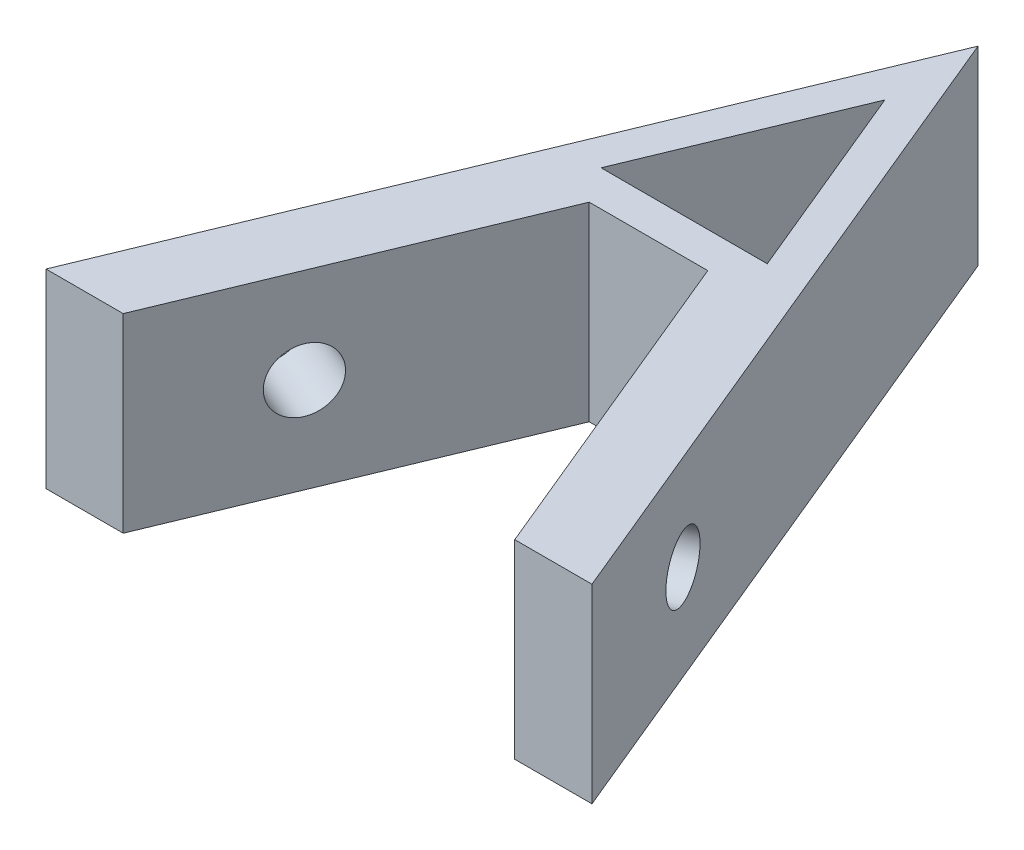
ISO-10303-21;
HEADER;
FILE_DESCRIPTION(('STEP AP214'),'2;1');
FILE_NAME('part.step','',(''),(''),'','','');
FILE_SCHEMA(('AUTOMOTIVE_DESIGN { 1 0 10303 214 1 1 1 1 }'));
ENDSEC;
DATA;
#1=APPLICATION_CONTEXT('core data for automotive mechanical design processes');
#2=APPLICATION_PROTOCOL_DEFINITION('international standard','automotive_design',2000,#1);
#3=PRODUCT_CONTEXT('',#1,'mechanical');
#4=PRODUCT('Part','Part','',(#3));
#5=PRODUCT_RELATED_PRODUCT_CATEGORY('part','',(#4));
#6=PRODUCT_DEFINITION_FORMATION('','',#4);
#7=PRODUCT_DEFINITION_CONTEXT('part definition',#1,'design');
#8=PRODUCT_DEFINITION('design','',#6,#7);
#9=PRODUCT_DEFINITION_SHAPE('','',#8);
#10=(LENGTH_UNIT() NAMED_UNIT(*) SI_UNIT(.MILLI.,.METRE.));
#11=(NAMED_UNIT(*) PLANE_ANGLE_UNIT() SI_UNIT($,.RADIAN.));
#12=(NAMED_UNIT(*) SI_UNIT($,.STERADIAN.) SOLID_ANGLE_UNIT());
#13=UNCERTAINTY_MEASURE_WITH_UNIT(LENGTH_MEASURE(1.E-05),#10,'distance_accuracy_value','');
#14=(GEOMETRIC_REPRESENTATION_CONTEXT(3) GLOBAL_UNCERTAINTY_ASSIGNED_CONTEXT((#13)) GLOBAL_UNIT_ASSIGNED_CONTEXT((#10,
#11,#12)) REPRESENTATION_CONTEXT('',''));
#15=CARTESIAN_POINT('',(0.,0.,0.));
#16=DIRECTION('',(0.,0.,1.));
#17=DIRECTION('',(1.,0.,0.));
#18=AXIS2_PLACEMENT_3D('',#15,#16,#17);
#19=CARTESIAN_POINT('',(-22.9610059419052,16.,55.4327719506773));
#20=DIRECTION('',(0.,0.,-1.));
#21=DIRECTION('',(-1.,0.,0.));
#22=AXIS2_PLACEMENT_3D('',#19,#20,#21);
#23=PLANE('',#22);
#24=DIRECTION('',(1.,0.,0.));
#25=VECTOR('',#24,1.);
#26=CARTESIAN_POINT('',(-22.9610059419052,0.,55.4327719506773));
#27=LINE('',#26,#25);
#28=CARTESIAN_POINT('',(-22.9610059419052,0.,55.4327719506773));
#29=VERTEX_POINT('',#28);
#30=CARTESIAN_POINT('',(-16.4666527401509,0.,55.4327719506773));
#31=VERTEX_POINT('',#30);
#32=EDGE_CURVE('E147',#29,#31,#27,.T.);
#33=ORIENTED_EDGE('',*,*,#32,.T.);
#34=DIRECTION('',(0.,1.,0.));
#35=VECTOR('',#34,1.);
#36=CARTESIAN_POINT('',(-16.4666527401509,0.,55.4327719506773));
#37=LINE('',#36,#35);
#38=CARTESIAN_POINT('',(-16.4666527401509,16.,55.4327719506773));
#39=VERTEX_POINT('',#38);
#40=EDGE_CURVE('E183',#31,#39,#37,.T.);
#41=ORIENTED_EDGE('',*,*,#40,.T.);
#42=DIRECTION('',(1.,0.,0.));
#43=VECTOR('',#42,1.);
#44=CARTESIAN_POINT('',(-22.9610059419052,16.,55.4327719506773));
#45=LINE('',#44,#43);
#46=CARTESIAN_POINT('',(-22.9610059419052,16.,55.4327719506773));
#47=VERTEX_POINT('',#46);
#48=EDGE_CURVE('E157',#47,#39,#45,.T.);
#49=ORIENTED_EDGE('',*,*,#48,.F.);
#50=DIRECTION('',(0.,-1.,0.));
#51=VECTOR('',#50,1.);
#52=CARTESIAN_POINT('',(-22.9610059419052,16.,55.4327719506773));
#53=LINE('',#52,#51);
#54=EDGE_CURVE('E52',#47,#29,#53,.T.);
#55=ORIENTED_EDGE('',*,*,#54,.T.);
#56=EDGE_LOOP('',(#33,#41,#49,#55));
#57=FACE_BOUND('',#56,.T.);
#58=ADVANCED_FACE('F43',(#57),#23,.F.);
#59=CARTESIAN_POINT('',(22.9610059419052,16.,55.4327719506773));
#60=DIRECTION('',(-0.923879532511288,0.,0.382683432365087));
#61=DIRECTION('',(0.382683432365087,0.,0.923879532511288));
#62=AXIS2_PLACEMENT_3D('',#59,#60,#61);
#63=PLANE('',#62);
#64=CARTESIAN_POINT('',(17.5460353739393,8.,42.3598765656426));
#65=DIRECTION('',(0.923879532511288,0.,-0.382683432365087));
#66=DIRECTION('',(-0.382683432365087,0.,-0.923879532511288));
#67=AXIS2_PLACEMENT_3D('',#64,#65,#66);
#68=CIRCLE('',#67,2.65000000000001);
#69=CARTESIAN_POINT('',(16.5319242781718,8.,39.9115958044876));
#70=VERTEX_POINT('',#69);
#71=EDGE_CURVE('E162',#70,#70,#68,.T.);
#72=ORIENTED_EDGE('',*,*,#71,.F.);
#73=EDGE_LOOP('',(#72));
#74=FACE_BOUND('',#73,.T.);
#75=DIRECTION('',(-0.382683432365087,0.,-0.923879532511288));
#76=VECTOR('',#75,1.);
#77=CARTESIAN_POINT('',(22.9610059419052,0.,55.4327719506773));
#78=LINE('',#77,#76);
#79=CARTESIAN_POINT('',(22.9610059419052,0.,55.4327719506773));
#80=VERTEX_POINT('',#79);
#81=CARTESIAN_POINT('',(0.,0.,0.));
#82=VERTEX_POINT('',#81);
#83=EDGE_CURVE('E146',#80,#82,#78,.T.);
#84=ORIENTED_EDGE('',*,*,#83,.T.);
#85=DIRECTION('',(0.,-1.,0.));
#86=VECTOR('',#85,1.);
#87=CARTESIAN_POINT('',(0.,16.,0.));
#88=LINE('',#87,#86);
#89=CARTESIAN_POINT('',(0.,16.,0.));
#90=VERTEX_POINT('',#89);
#91=EDGE_CURVE('E11',#90,#82,#88,.T.);
#92=ORIENTED_EDGE('',*,*,#91,.F.);
#93=DIRECTION('',(-0.382683432365087,0.,-0.923879532511288));
#94=VECTOR('',#93,1.);
#95=CARTESIAN_POINT('',(22.9610059419052,16.,55.4327719506773));
#96=LINE('',#95,#94);
#97=CARTESIAN_POINT('',(22.9610059419052,16.,55.4327719506773));
#98=VERTEX_POINT('',#97);
#99=EDGE_CURVE('E151',#98,#90,#96,.T.);
#100=ORIENTED_EDGE('',*,*,#99,.F.);
#101=DIRECTION('',(0.,-1.,0.));
#102=VECTOR('',#101,1.);
#103=CARTESIAN_POINT('',(22.9610059419052,16.,55.4327719506773));
#104=LINE('',#103,#102);
#105=EDGE_CURVE('E155',#98,#80,#104,.T.);
#106=ORIENTED_EDGE('',*,*,#105,.T.);
#107=EDGE_LOOP('',(#84,#92,#100,#106));
#108=FACE_BOUND('',#107,.T.);
#109=ADVANCED_FACE('F45',(#74,#108),#63,.F.);
#110=CARTESIAN_POINT('',(0.,16.,0.));
#111=DIRECTION('',(0.923879532511288,0.,0.382683432365087));
#112=DIRECTION('',(0.382683432365087,0.,-0.923879532511288));
#113=AXIS2_PLACEMENT_3D('',#110,#111,#112);
#114=PLANE('',#113);
#115=CARTESIAN_POINT('',(-17.5460353739393,8.,42.3598765656426));
#116=DIRECTION('',(-0.923879532511288,0.,-0.382683432365087));
#117=DIRECTION('',(-0.382683432365087,0.,0.923879532511288));
#118=AXIS2_PLACEMENT_3D('',#115,#116,#117);
#119=CIRCLE('',#118,2.65);
#120=CARTESIAN_POINT('',(-18.5601464697067,8.,44.8081573267975));
#121=VERTEX_POINT('',#120);
#122=EDGE_CURVE('E172',#121,#121,#119,.T.);
#123=ORIENTED_EDGE('',*,*,#122,.F.);
#124=EDGE_LOOP('',(#123));
#125=FACE_BOUND('',#124,.T.);
#126=DIRECTION('',(-0.382683432365087,0.,0.923879532511288));
#127=VECTOR('',#126,1.);
#128=CARTESIAN_POINT('',(0.,0.,0.));
#129=LINE('',#128,#127);
#130=EDGE_CURVE('E148',#82,#29,#129,.T.);
#131=ORIENTED_EDGE('',*,*,#130,.T.);
#132=ORIENTED_EDGE('',*,*,#54,.F.);
#133=DIRECTION('',(-0.382683432365087,0.,0.923879532511288));
#134=VECTOR('',#133,1.);
#135=CARTESIAN_POINT('',(0.,16.,0.));
#136=LINE('',#135,#134);
#137=EDGE_CURVE('E210',#90,#47,#136,.T.);
#138=ORIENTED_EDGE('',*,*,#137,.F.);
#139=ORIENTED_EDGE('',*,*,#91,.T.);
#140=EDGE_LOOP('',(#131,#132,#138,#139));
#141=FACE_BOUND('',#140,.T.);
#142=ADVANCED_FACE('F229',(#125,#141),#114,.F.);
#143=CARTESIAN_POINT('',(16.4666527401509,16.,55.4327719506773));
#144=VERTEX_POINT('',#143);
#145=EDGE_CURVE('E138',#144,#98,#45,.T.);
#146=ORIENTED_EDGE('',*,*,#145,.F.);
#147=DIRECTION('',(0.,1.,0.));
#148=VECTOR('',#147,1.);
#149=CARTESIAN_POINT('',(16.4666527401509,0.,55.4327719506773));
#150=LINE('',#149,#148);
#151=CARTESIAN_POINT('',(16.4666527401509,0.,55.4327719506773));
#152=VERTEX_POINT('',#151);
#153=EDGE_CURVE('E125',#152,#144,#150,.T.);
#154=ORIENTED_EDGE('',*,*,#153,.F.);
#155=EDGE_CURVE('E136',#152,#80,#27,.T.);
#156=ORIENTED_EDGE('',*,*,#155,.T.);
#157=ORIENTED_EDGE('',*,*,#105,.F.);
#158=EDGE_LOOP('',(#146,#154,#156,#157));
#159=FACE_BOUND('',#158,.T.);
#160=ADVANCED_FACE('F134',(#159),#23,.F.);
#161=CARTESIAN_POINT('',(0.,16.,0.));
#162=DIRECTION('',(0.,-1.,0.));
#163=DIRECTION('',(0.,0.,-1.));
#164=AXIS2_PLACEMENT_3D('',#161,#162,#163);
#165=PLANE('',#164);
#166=DIRECTION('',(1.,0.,0.));
#167=VECTOR('',#166,1.);
#168=CARTESIAN_POINT('',(-6.99068568295617,16.,24.7163859753386));
#169=LINE('',#168,#167);
#170=CARTESIAN_POINT('',(-6.99068568295617,16.,24.7163859753386));
#171=VERTEX_POINT('',#170);
#172=CARTESIAN_POINT('',(6.99068568295616,16.,24.7163859753386));
#173=VERTEX_POINT('',#172);
#174=EDGE_CURVE('E196',#171,#173,#169,.T.);
#175=ORIENTED_EDGE('',*,*,#174,.F.);
#176=DIRECTION('',(-0.382683432365087,0.,0.923879532511288));
#177=VECTOR('',#176,1.);
#178=CARTESIAN_POINT('',(0.,16.,7.83937778925831));
#179=LINE('',#178,#177);
#180=CARTESIAN_POINT('',(0.,16.,7.83937778925831));
#181=VERTEX_POINT('',#180);
#182=EDGE_CURVE('E60',#181,#171,#179,.T.);
#183=ORIENTED_EDGE('',*,*,#182,.F.);
#184=DIRECTION('',(-0.382683432365087,0.,-0.923879532511288));
#185=VECTOR('',#184,1.);
#186=CARTESIAN_POINT('',(6.99068568295616,16.,24.7163859753386));
#187=LINE('',#186,#185);
#188=EDGE_CURVE('E193',#173,#181,#187,.T.);
#189=ORIENTED_EDGE('',*,*,#188,.F.);
#190=EDGE_LOOP('',(#175,#183,#189));
#191=FACE_BOUND('',#190,.T.);
#192=ORIENTED_EDGE('',*,*,#48,.T.);
#193=DIRECTION('',(-0.382683432365087,0.,0.923879532511288));
#194=VECTOR('',#193,1.);
#195=CARTESIAN_POINT('',(-16.4666527401509,16.,55.4327719506773));
#196=LINE('',#195,#194);
#197=CARTESIAN_POINT('',(-4.98614976919826,16.,27.7163859753386));
#198=VERTEX_POINT('',#197);
#199=EDGE_CURVE('E130',#198,#39,#196,.T.);
#200=ORIENTED_EDGE('',*,*,#199,.F.);
#201=DIRECTION('',(-1.,0.,0.));
#202=VECTOR('',#201,1.);
#203=CARTESIAN_POINT('',(4.98614976919825,16.,27.7163859753386));
#204=LINE('',#203,#202);
#205=CARTESIAN_POINT('',(4.98614976919825,16.,27.7163859753386));
#206=VERTEX_POINT('',#205);
#207=EDGE_CURVE('E179',#206,#198,#204,.T.);
#208=ORIENTED_EDGE('',*,*,#207,.F.);
#209=DIRECTION('',(-0.382683432365087,0.,-0.923879532511288));
#210=VECTOR('',#209,1.);
#211=CARTESIAN_POINT('',(16.4666527401509,16.,55.4327719506773));
#212=LINE('',#211,#210);
#213=EDGE_CURVE('E177',#144,#206,#212,.T.);
#214=ORIENTED_EDGE('',*,*,#213,.F.);
#215=ORIENTED_EDGE('',*,*,#145,.T.);
#216=ORIENTED_EDGE('',*,*,#99,.T.);
#217=ORIENTED_EDGE('',*,*,#137,.T.);
#218=EDGE_LOOP('',(#192,#200,#208,#214,#215,#216,#217));
#219=FACE_BOUND('',#218,.T.);
#220=ADVANCED_FACE('F217',(#191,#219),#165,.F.);
#221=CARTESIAN_POINT('',(0.,0.,0.));
#222=DIRECTION('',(0.,-1.,0.));
#223=DIRECTION('',(0.,0.,-1.));
#224=AXIS2_PLACEMENT_3D('',#221,#222,#223);
#225=PLANE('',#224);
#226=DIRECTION('',(-0.382683432365087,0.,0.923879532511288));
#227=VECTOR('',#226,1.);
#228=CARTESIAN_POINT('',(-16.4666527401509,0.,55.4327719506773));
#229=LINE('',#228,#227);
#230=CARTESIAN_POINT('',(-4.98614976919826,0.,27.7163859753386));
#231=VERTEX_POINT('',#230);
#232=EDGE_CURVE('E139',#231,#31,#229,.T.);
#233=ORIENTED_EDGE('',*,*,#232,.T.);
#234=ORIENTED_EDGE('',*,*,#32,.F.);
#235=ORIENTED_EDGE('',*,*,#130,.F.);
#236=ORIENTED_EDGE('',*,*,#83,.F.);
#237=ORIENTED_EDGE('',*,*,#155,.F.);
#238=DIRECTION('',(-0.382683432365087,0.,-0.923879532511288));
#239=VECTOR('',#238,1.);
#240=CARTESIAN_POINT('',(16.4666527401509,0.,55.4327719506773));
#241=LINE('',#240,#239);
#242=CARTESIAN_POINT('',(4.98614976919825,0.,27.7163859753386));
#243=VERTEX_POINT('',#242);
#244=EDGE_CURVE('E121',#152,#243,#241,.T.);
#245=ORIENTED_EDGE('',*,*,#244,.T.);
#246=DIRECTION('',(-1.,0.,0.));
#247=VECTOR('',#246,1.);
#248=CARTESIAN_POINT('',(4.98614976919825,0.,27.7163859753386));
#249=LINE('',#248,#247);
#250=EDGE_CURVE('E68',#243,#231,#249,.T.);
#251=ORIENTED_EDGE('',*,*,#250,.T.);
#252=EDGE_LOOP('',(#233,#234,#235,#236,#237,#245,#251));
#253=FACE_BOUND('',#252,.T.);
#254=DIRECTION('',(-0.382683432365087,0.,0.923879532511288));
#255=VECTOR('',#254,1.);
#256=CARTESIAN_POINT('',(0.,0.,7.83937778925831));
#257=LINE('',#256,#255);
#258=CARTESIAN_POINT('',(0.,0.,7.83937778925831));
#259=VERTEX_POINT('',#258);
#260=CARTESIAN_POINT('',(-6.99068568295617,0.,24.7163859753386));
#261=VERTEX_POINT('',#260);
#262=EDGE_CURVE('E197',#259,#261,#257,.T.);
#263=ORIENTED_EDGE('',*,*,#262,.T.);
#264=DIRECTION('',(1.,0.,0.));
#265=VECTOR('',#264,1.);
#266=CARTESIAN_POINT('',(-6.99068568295617,0.,24.7163859753386));
#267=LINE('',#266,#265);
#268=CARTESIAN_POINT('',(6.99068568295616,0.,24.7163859753386));
#269=VERTEX_POINT('',#268);
#270=EDGE_CURVE('E203',#261,#269,#267,.T.);
#271=ORIENTED_EDGE('',*,*,#270,.T.);
#272=DIRECTION('',(-0.382683432365087,0.,-0.923879532511288));
#273=VECTOR('',#272,1.);
#274=CARTESIAN_POINT('',(6.99068568295616,0.,24.7163859753386));
#275=LINE('',#274,#273);
#276=EDGE_CURVE('E191',#269,#259,#275,.T.);
#277=ORIENTED_EDGE('',*,*,#276,.T.);
#278=EDGE_LOOP('',(#263,#271,#277));
#279=FACE_BOUND('',#278,.T.);
#280=ADVANCED_FACE('F143',(#253,#279),#225,.T.);
#281=CARTESIAN_POINT('',(0.,0.,7.83937778925831));
#282=DIRECTION('',(-0.923879532511288,0.,-0.382683432365087));
#283=DIRECTION('',(-0.382683432365087,0.,0.923879532511288));
#284=AXIS2_PLACEMENT_3D('',#281,#282,#283);
#285=PLANE('',#284);
#286=ORIENTED_EDGE('',*,*,#182,.T.);
#287=DIRECTION('',(0.,1.,0.));
#288=VECTOR('',#287,1.);
#289=CARTESIAN_POINT('',(-6.99068568295617,0.,24.7163859753386));
#290=LINE('',#289,#288);
#291=EDGE_CURVE('E189',#261,#171,#290,.T.);
#292=ORIENTED_EDGE('',*,*,#291,.F.);
#293=ORIENTED_EDGE('',*,*,#262,.F.);
#294=DIRECTION('',(0.,1.,0.));
#295=VECTOR('',#294,1.);
#296=CARTESIAN_POINT('',(0.,0.,7.83937778925831));
#297=LINE('',#296,#295);
#298=EDGE_CURVE('E161',#259,#181,#297,.T.);
#299=ORIENTED_EDGE('',*,*,#298,.T.);
#300=EDGE_LOOP('',(#286,#292,#293,#299));
#301=FACE_BOUND('',#300,.T.);
#302=ADVANCED_FACE('F247',(#301),#285,.F.);
#303=CARTESIAN_POINT('',(6.99068568295616,0.,24.7163859753386));
#304=DIRECTION('',(0.923879532511288,0.,-0.382683432365087));
#305=DIRECTION('',(-0.382683432365087,0.,-0.923879532511288));
#306=AXIS2_PLACEMENT_3D('',#303,#304,#305);
#307=PLANE('',#306);
#308=ORIENTED_EDGE('',*,*,#188,.T.);
#309=ORIENTED_EDGE('',*,*,#298,.F.);
#310=ORIENTED_EDGE('',*,*,#276,.F.);
#311=DIRECTION('',(0.,1.,0.));
#312=VECTOR('',#311,1.);
#313=CARTESIAN_POINT('',(6.99068568295616,0.,24.7163859753386));
#314=LINE('',#313,#312);
#315=EDGE_CURVE('E165',#269,#173,#314,.T.);
#316=ORIENTED_EDGE('',*,*,#315,.T.);
#317=EDGE_LOOP('',(#308,#309,#310,#316));
#318=FACE_BOUND('',#317,.T.);
#319=ADVANCED_FACE('F251',(#318),#307,.F.);
#320=CARTESIAN_POINT('',(-6.99068568295617,0.,24.7163859753386));
#321=DIRECTION('',(0.,0.,1.));
#322=DIRECTION('',(1.,0.,0.));
#323=AXIS2_PLACEMENT_3D('',#320,#321,#322);
#324=PLANE('',#323);
#325=ORIENTED_EDGE('',*,*,#174,.T.);
#326=ORIENTED_EDGE('',*,*,#315,.F.);
#327=ORIENTED_EDGE('',*,*,#270,.F.);
#328=ORIENTED_EDGE('',*,*,#291,.T.);
#329=EDGE_LOOP('',(#325,#326,#327,#328));
#330=FACE_BOUND('',#329,.T.);
#331=ADVANCED_FACE('F254',(#330),#324,.F.);
#332=CARTESIAN_POINT('',(-16.4666527401509,0.,55.4327719506773));
#333=DIRECTION('',(-0.923879532511288,0.,-0.382683432365087));
#334=DIRECTION('',(-0.382683432365087,0.,0.923879532511288));
#335=AXIS2_PLACEMENT_3D('',#332,#333,#334);
#336=PLANE('',#335);
#337=CARTESIAN_POINT('',(-12.0027581788715,8.,44.6559771598331));
#338=DIRECTION('',(-0.923879532511288,0.,-0.382683432365087));
#339=DIRECTION('',(-0.382683432365087,0.,0.923879532511288));
#340=AXIS2_PLACEMENT_3D('',#337,#338,#339);
#341=CIRCLE('',#340,2.65);
#342=CARTESIAN_POINT('',(-13.016869274639,8.,47.104257920988));
#343=VERTEX_POINT('',#342);
#344=EDGE_CURVE('E47',#343,#343,#341,.T.);
#345=ORIENTED_EDGE('',*,*,#344,.T.);
#346=EDGE_LOOP('',(#345));
#347=FACE_BOUND('',#346,.T.);
#348=ORIENTED_EDGE('',*,*,#199,.T.);
#349=ORIENTED_EDGE('',*,*,#40,.F.);
#350=ORIENTED_EDGE('',*,*,#232,.F.);
#351=DIRECTION('',(0.,1.,0.));
#352=VECTOR('',#351,1.);
#353=CARTESIAN_POINT('',(-4.98614976919826,0.,27.7163859753386));
#354=LINE('',#353,#352);
#355=EDGE_CURVE('E186',#231,#198,#354,.T.);
#356=ORIENTED_EDGE('',*,*,#355,.T.);
#357=EDGE_LOOP('',(#348,#349,#350,#356));
#358=FACE_BOUND('',#357,.T.);
#359=ADVANCED_FACE('F224',(#347,#358),#336,.F.);
#360=CARTESIAN_POINT('',(4.98614976919825,0.,27.7163859753386));
#361=DIRECTION('',(0.,0.,-1.));
#362=DIRECTION('',(-1.,0.,0.));
#363=AXIS2_PLACEMENT_3D('',#360,#361,#362);
#364=PLANE('',#363);
#365=ORIENTED_EDGE('',*,*,#207,.T.);
#366=ORIENTED_EDGE('',*,*,#355,.F.);
#367=ORIENTED_EDGE('',*,*,#250,.F.);
#368=DIRECTION('',(0.,1.,0.));
#369=VECTOR('',#368,1.);
#370=CARTESIAN_POINT('',(4.98614976919825,0.,27.7163859753386));
#371=LINE('',#370,#369);
#372=EDGE_CURVE('E127',#243,#206,#371,.T.);
#373=ORIENTED_EDGE('',*,*,#372,.T.);
#374=EDGE_LOOP('',(#365,#366,#367,#373));
#375=FACE_BOUND('',#374,.T.);
#376=ADVANCED_FACE('F221',(#375),#364,.F.);
#377=CARTESIAN_POINT('',(16.4666527401509,0.,55.4327719506773));
#378=DIRECTION('',(0.923879532511288,0.,-0.382683432365087));
#379=DIRECTION('',(-0.382683432365087,0.,-0.923879532511288));
#380=AXIS2_PLACEMENT_3D('',#377,#378,#379);
#381=PLANE('',#380);
#382=CARTESIAN_POINT('',(12.0027581788715,8.,44.6559771598331));
#383=DIRECTION('',(0.923879532511288,0.,-0.382683432365087));
#384=DIRECTION('',(-0.382683432365087,0.,-0.923879532511288));
#385=AXIS2_PLACEMENT_3D('',#382,#383,#384);
#386=CIRCLE('',#385,2.65000000000001);
#387=CARTESIAN_POINT('',(10.988647083104,8.,42.2076963986782));
#388=VERTEX_POINT('',#387);
#389=EDGE_CURVE('E159',#388,#388,#386,.T.);
#390=ORIENTED_EDGE('',*,*,#389,.T.);
#391=EDGE_LOOP('',(#390));
#392=FACE_BOUND('',#391,.T.);
#393=ORIENTED_EDGE('',*,*,#213,.T.);
#394=ORIENTED_EDGE('',*,*,#372,.F.);
#395=ORIENTED_EDGE('',*,*,#244,.F.);
#396=ORIENTED_EDGE('',*,*,#153,.T.);
#397=EDGE_LOOP('',(#393,#394,#395,#396));
#398=FACE_BOUND('',#397,.T.);
#399=ADVANCED_FACE('F124',(#392,#398),#381,.F.);
#400=CARTESIAN_POINT('',(2.76396285375865,8.,48.482811483484));
#401=DIRECTION('',(0.923879532511288,0.,-0.382683432365087));
#402=DIRECTION('',(-0.382683432365087,0.,-0.923879532511288));
#403=AXIS2_PLACEMENT_3D('',#400,#401,#402);
#404=CYLINDRICAL_SURFACE('',#403,2.65000000000001);
#405=ORIENTED_EDGE('',*,*,#71,.T.);
#406=EDGE_LOOP('',(#405));
#407=FACE_BOUND('',#406,.T.);
#408=ORIENTED_EDGE('',*,*,#389,.F.);
#409=EDGE_LOOP('',(#408));
#410=FACE_BOUND('',#409,.T.);
#411=ADVANCED_FACE('F263',(#407,#410),#404,.F.);
#412=CARTESIAN_POINT('',(-2.76396285375865,8.,48.482811483484));
#413=DIRECTION('',(-0.923879532511288,0.,-0.382683432365087));
#414=DIRECTION('',(-0.382683432365087,0.,0.923879532511288));
#415=AXIS2_PLACEMENT_3D('',#412,#413,#414);
#416=CYLINDRICAL_SURFACE('',#415,2.65);
#417=ORIENTED_EDGE('',*,*,#122,.T.);
#418=EDGE_LOOP('',(#417));
#419=FACE_BOUND('',#418,.T.);
#420=ORIENTED_EDGE('',*,*,#344,.F.);
#421=EDGE_LOOP('',(#420));
#422=FACE_BOUND('',#421,.T.);
#423=ADVANCED_FACE('F269',(#419,#422),#416,.F.);
#424=CLOSED_SHELL('',(#58,#109,#142,#160,#220,#280,#302,#319,#331,#359,#376,#399,#411,#423));
#425=MANIFOLD_SOLID_BREP('B2',#424);
#426=ADVANCED_BREP_SHAPE_REPRESENTATION('',(#18,#425),#14);
#427=SHAPE_DEFINITION_REPRESENTATION(#9,#426);
ENDSEC;
END-ISO-10303-21;
